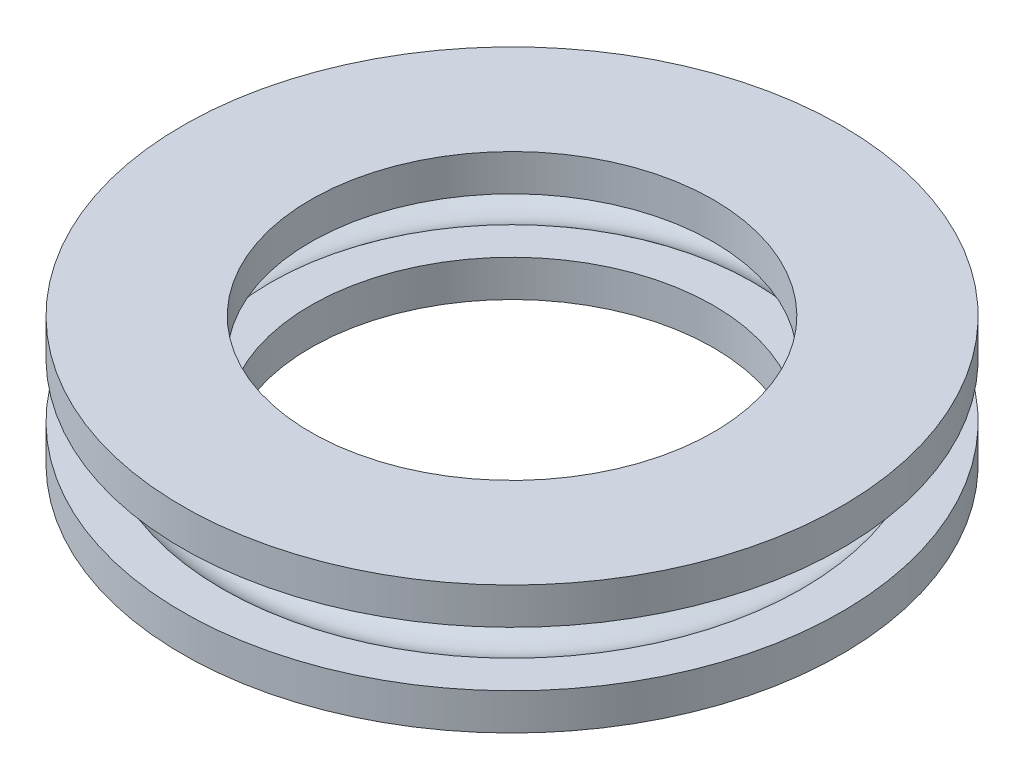
ISO-10303-21;
HEADER;
FILE_DESCRIPTION(('STEP AP214'),'2;1');
FILE_NAME('part.step','',(''),(''),'','','');
FILE_SCHEMA(('AUTOMOTIVE_DESIGN { 1 0 10303 214 1 1 1 1 }'));
ENDSEC;
DATA;
#1=APPLICATION_CONTEXT('core data for automotive mechanical design processes');
#2=APPLICATION_PROTOCOL_DEFINITION('international standard','automotive_design',2000,#1);
#3=PRODUCT_CONTEXT('',#1,'mechanical');
#4=PRODUCT('Part','Part','',(#3));
#5=PRODUCT_RELATED_PRODUCT_CATEGORY('part','',(#4));
#6=PRODUCT_DEFINITION_FORMATION('','',#4);
#7=PRODUCT_DEFINITION_CONTEXT('part definition',#1,'design');
#8=PRODUCT_DEFINITION('design','',#6,#7);
#9=PRODUCT_DEFINITION_SHAPE('','',#8);
#10=(LENGTH_UNIT() NAMED_UNIT(*) SI_UNIT(.MILLI.,.METRE.));
#11=(NAMED_UNIT(*) PLANE_ANGLE_UNIT() SI_UNIT($,.RADIAN.));
#12=(NAMED_UNIT(*) SI_UNIT($,.STERADIAN.) SOLID_ANGLE_UNIT());
#13=UNCERTAINTY_MEASURE_WITH_UNIT(LENGTH_MEASURE(1.E-05),#10,'distance_accuracy_value','');
#14=(GEOMETRIC_REPRESENTATION_CONTEXT(3) GLOBAL_UNCERTAINTY_ASSIGNED_CONTEXT((#13)) GLOBAL_UNIT_ASSIGNED_CONTEXT((#10,
#11,#12)) REPRESENTATION_CONTEXT('',''));
#15=CARTESIAN_POINT('',(0.,0.,0.));
#16=DIRECTION('',(0.,0.,1.));
#17=DIRECTION('',(1.,0.,0.));
#18=AXIS2_PLACEMENT_3D('',#15,#16,#17);
#19=CARTESIAN_POINT('',(0.,0.,0.));
#20=DIRECTION('',(0.,-1.,0.));
#21=DIRECTION('',(0.,0.,-1.));
#22=AXIS2_PLACEMENT_3D('',#19,#20,#21);
#23=TOROIDAL_SURFACE('',#22,36.25,4.99999999999998);
#24=CARTESIAN_POINT('',(0.,3.74999999999999,0.));
#25=DIRECTION('',(0.,-1.,0.));
#26=DIRECTION('',(0.,0.,-1.));
#27=AXIS2_PLACEMENT_3D('',#24,#25,#26);
#28=CIRCLE('',#27,39.5571891388307);
#29=CARTESIAN_POINT('',(0.,3.74999999999999,-39.5571891388307));
#30=VERTEX_POINT('',#29);
#31=EDGE_CURVE('E67',#30,#30,#28,.T.);
#32=ORIENTED_EDGE('',*,*,#31,.T.);
#33=EDGE_LOOP('',(#32));
#34=FACE_BOUND('',#33,.T.);
#35=CARTESIAN_POINT('',(0.,3.74999999999999,0.));
#36=DIRECTION('',(0.,-1.,0.));
#37=DIRECTION('',(0.,0.,-1.));
#38=AXIS2_PLACEMENT_3D('',#35,#36,#37);
#39=CIRCLE('',#38,32.9428108611692);
#40=CARTESIAN_POINT('',(0.,3.74999999999999,-32.9428108611692));
#41=VERTEX_POINT('',#40);
#42=EDGE_CURVE('E11',#41,#41,#39,.T.);
#43=ORIENTED_EDGE('',*,*,#42,.F.);
#44=EDGE_LOOP('',(#43));
#45=FACE_BOUND('',#44,.T.);
#46=ADVANCED_FACE('F45',(#34,#45),#23,.F.);
#47=CARTESIAN_POINT('',(0.,3.74999999999998,-27.4999999999999));
#48=DIRECTION('',(0.,-1.,0.));
#49=DIRECTION('',(0.,0.,-1.));
#50=AXIS2_PLACEMENT_3D('',#47,#48,#49);
#51=PLANE('',#50);
#52=ORIENTED_EDGE('',*,*,#42,.T.);
#53=EDGE_LOOP('',(#52));
#54=FACE_BOUND('',#53,.T.);
#55=CARTESIAN_POINT('',(0.,3.74999999999998,0.));
#56=DIRECTION('',(0.,-1.,0.));
#57=DIRECTION('',(0.,0.,-1.));
#58=AXIS2_PLACEMENT_3D('',#55,#56,#57);
#59=CIRCLE('',#58,27.4999999999999);
#60=CARTESIAN_POINT('',(0.,3.74999999999998,-27.4999999999999));
#61=VERTEX_POINT('',#60);
#62=EDGE_CURVE('E51',#61,#61,#59,.T.);
#63=ORIENTED_EDGE('',*,*,#62,.F.);
#64=EDGE_LOOP('',(#63));
#65=FACE_BOUND('',#64,.T.);
#66=ADVANCED_FACE('F85',(#54,#65),#51,.T.);
#67=CARTESIAN_POINT('',(0.,-72.7775968739822,0.));
#68=DIRECTION('',(0.,-1.,0.));
#69=DIRECTION('',(0.,0.,-1.));
#70=AXIS2_PLACEMENT_3D('',#67,#68,#69);
#71=CYLINDRICAL_SURFACE('',#70,27.4999999999999);
#72=ORIENTED_EDGE('',*,*,#62,.T.);
#73=EDGE_LOOP('',(#72));
#74=FACE_BOUND('',#73,.T.);
#75=CARTESIAN_POINT('',(0.,8.74999999999999,0.));
#76=DIRECTION('',(0.,-1.,0.));
#77=DIRECTION('',(0.,0.,-1.));
#78=AXIS2_PLACEMENT_3D('',#75,#76,#77);
#79=CIRCLE('',#78,27.4999999999999);
#80=CARTESIAN_POINT('',(0.,8.74999999999999,-27.4999999999999));
#81=VERTEX_POINT('',#80);
#82=EDGE_CURVE('E55',#81,#81,#79,.T.);
#83=ORIENTED_EDGE('',*,*,#82,.F.);
#84=EDGE_LOOP('',(#83));
#85=FACE_BOUND('',#84,.T.);
#86=ADVANCED_FACE('F89',(#74,#85),#71,.F.);
#87=CARTESIAN_POINT('',(0.,8.74999999999999,-27.4999999999999));
#88=DIRECTION('',(0.,1.,0.));
#89=DIRECTION('',(0.,0.,1.));
#90=AXIS2_PLACEMENT_3D('',#87,#88,#89);
#91=PLANE('',#90);
#92=ORIENTED_EDGE('',*,*,#82,.T.);
#93=EDGE_LOOP('',(#92));
#94=FACE_BOUND('',#93,.T.);
#95=CARTESIAN_POINT('',(0.,8.74999999999999,0.));
#96=DIRECTION('',(0.,-1.,0.));
#97=DIRECTION('',(0.,0.,-1.));
#98=AXIS2_PLACEMENT_3D('',#95,#96,#97);
#99=CIRCLE('',#98,44.9999999999999);
#100=CARTESIAN_POINT('',(0.,8.74999999999999,-44.9999999999999));
#101=VERTEX_POINT('',#100);
#102=EDGE_CURVE('E59',#101,#101,#99,.T.);
#103=ORIENTED_EDGE('',*,*,#102,.F.);
#104=EDGE_LOOP('',(#103));
#105=FACE_BOUND('',#104,.T.);
#106=ADVANCED_FACE('F81',(#94,#105),#91,.T.);
#107=CARTESIAN_POINT('',(0.,-72.7775968739822,0.));
#108=DIRECTION('',(0.,-1.,0.));
#109=DIRECTION('',(0.,0.,-1.));
#110=AXIS2_PLACEMENT_3D('',#107,#108,#109);
#111=CYLINDRICAL_SURFACE('',#110,44.9999999999999);
#112=ORIENTED_EDGE('',*,*,#102,.T.);
#113=EDGE_LOOP('',(#112));
#114=FACE_BOUND('',#113,.T.);
#115=CARTESIAN_POINT('',(0.,3.74999999999999,0.));
#116=DIRECTION('',(0.,-1.,0.));
#117=DIRECTION('',(0.,0.,-1.));
#118=AXIS2_PLACEMENT_3D('',#115,#116,#117);
#119=CIRCLE('',#118,44.9999999999999);
#120=CARTESIAN_POINT('',(0.,3.74999999999999,-44.9999999999999));
#121=VERTEX_POINT('',#120);
#122=EDGE_CURVE('E64',#121,#121,#119,.T.);
#123=ORIENTED_EDGE('',*,*,#122,.F.);
#124=EDGE_LOOP('',(#123));
#125=FACE_BOUND('',#124,.T.);
#126=ADVANCED_FACE('F75',(#114,#125),#111,.T.);
#127=CARTESIAN_POINT('',(0.,3.74999999999999,-39.5571891388307));
#128=DIRECTION('',(0.,-1.,0.));
#129=DIRECTION('',(0.,0.,-1.));
#130=AXIS2_PLACEMENT_3D('',#127,#128,#129);
#131=PLANE('',#130);
#132=ORIENTED_EDGE('',*,*,#122,.T.);
#133=EDGE_LOOP('',(#132));
#134=FACE_BOUND('',#133,.T.);
#135=ORIENTED_EDGE('',*,*,#31,.F.);
#136=EDGE_LOOP('',(#135));
#137=FACE_BOUND('',#136,.T.);
#138=ADVANCED_FACE('F73',(#134,#137),#131,.T.);
#139=CLOSED_SHELL('',(#46,#66,#86,#106,#126,#138));
#140=MANIFOLD_SOLID_BREP('B2',#139);
#141=CARTESIAN_POINT('',(0.,-3.74999999999998,-39.5571891388307));
#142=DIRECTION('',(0.,1.,0.));
#143=DIRECTION('',(0.,0.,1.));
#144=AXIS2_PLACEMENT_3D('',#141,#142,#143);
#145=PLANE('',#144);
#146=CARTESIAN_POINT('',(0.,-3.74999999999999,0.));
#147=DIRECTION('',(0.,-1.,0.));
#148=DIRECTION('',(0.,0.,-1.));
#149=AXIS2_PLACEMENT_3D('',#146,#147,#148);
#150=CIRCLE('',#149,39.5571891388307);
#151=CARTESIAN_POINT('',(0.,-3.74999999999999,-39.5571891388307));
#152=VERTEX_POINT('',#151);
#153=EDGE_CURVE('E44',#152,#152,#150,.T.);
#154=ORIENTED_EDGE('',*,*,#153,.T.);
#155=EDGE_LOOP('',(#154));
#156=FACE_BOUND('',#155,.T.);
#157=CARTESIAN_POINT('',(0.,-3.74999999999999,0.));
#158=DIRECTION('',(0.,-1.,0.));
#159=DIRECTION('',(0.,0.,-1.));
#160=AXIS2_PLACEMENT_3D('',#157,#158,#159);
#161=CIRCLE('',#160,45.);
#162=CARTESIAN_POINT('',(0.,-3.74999999999999,-45.));
#163=VERTEX_POINT('',#162);
#164=EDGE_CURVE('E159',#163,#163,#161,.T.);
#165=ORIENTED_EDGE('',*,*,#164,.F.);
#166=EDGE_LOOP('',(#165));
#167=FACE_BOUND('',#166,.T.);
#168=ADVANCED_FACE('F137',(#156,#167),#145,.T.);
#169=CARTESIAN_POINT('',(0.,0.,0.));
#170=DIRECTION('',(0.,-1.,0.));
#171=DIRECTION('',(0.,0.,-1.));
#172=AXIS2_PLACEMENT_3D('',#169,#170,#171);
#173=TOROIDAL_SURFACE('',#172,36.25,5.);
#174=CARTESIAN_POINT('',(0.,-3.74999999999999,0.));
#175=DIRECTION('',(0.,-1.,0.));
#176=DIRECTION('',(0.,0.,-1.));
#177=AXIS2_PLACEMENT_3D('',#174,#175,#176);
#178=CIRCLE('',#177,32.9428108611693);
#179=CARTESIAN_POINT('',(0.,-3.74999999999999,-32.9428108611693));
#180=VERTEX_POINT('',#179);
#181=EDGE_CURVE('E143',#180,#180,#178,.T.);
#182=ORIENTED_EDGE('',*,*,#181,.T.);
#183=EDGE_LOOP('',(#182));
#184=FACE_BOUND('',#183,.T.);
#185=ORIENTED_EDGE('',*,*,#153,.F.);
#186=EDGE_LOOP('',(#185));
#187=FACE_BOUND('',#186,.T.);
#188=ADVANCED_FACE('F167',(#184,#187),#173,.F.);
#189=CARTESIAN_POINT('',(0.,-3.74999999999998,-27.5));
#190=DIRECTION('',(0.,1.,0.));
#191=DIRECTION('',(0.,0.,1.));
#192=AXIS2_PLACEMENT_3D('',#189,#190,#191);
#193=PLANE('',#192);
#194=CARTESIAN_POINT('',(0.,-3.74999999999998,0.));
#195=DIRECTION('',(0.,-1.,0.));
#196=DIRECTION('',(0.,0.,-1.));
#197=AXIS2_PLACEMENT_3D('',#194,#195,#196);
#198=CIRCLE('',#197,27.5);
#199=CARTESIAN_POINT('',(0.,-3.74999999999998,-27.5));
#200=VERTEX_POINT('',#199);
#201=EDGE_CURVE('E147',#200,#200,#198,.T.);
#202=ORIENTED_EDGE('',*,*,#201,.T.);
#203=EDGE_LOOP('',(#202));
#204=FACE_BOUND('',#203,.T.);
#205=ORIENTED_EDGE('',*,*,#181,.F.);
#206=EDGE_LOOP('',(#205));
#207=FACE_BOUND('',#206,.T.);
#208=ADVANCED_FACE('F171',(#204,#207),#193,.T.);
#209=CARTESIAN_POINT('',(0.,-72.7775968739822,0.));
#210=DIRECTION('',(0.,-1.,0.));
#211=DIRECTION('',(0.,0.,-1.));
#212=AXIS2_PLACEMENT_3D('',#209,#210,#211);
#213=CYLINDRICAL_SURFACE('',#212,27.5);
#214=CARTESIAN_POINT('',(0.,-8.74999999999999,0.));
#215=DIRECTION('',(0.,-1.,0.));
#216=DIRECTION('',(0.,0.,-1.));
#217=AXIS2_PLACEMENT_3D('',#214,#215,#216);
#218=CIRCLE('',#217,27.5);
#219=CARTESIAN_POINT('',(0.,-8.74999999999999,-27.5));
#220=VERTEX_POINT('',#219);
#221=EDGE_CURVE('E151',#220,#220,#218,.T.);
#222=ORIENTED_EDGE('',*,*,#221,.T.);
#223=EDGE_LOOP('',(#222));
#224=FACE_BOUND('',#223,.T.);
#225=ORIENTED_EDGE('',*,*,#201,.F.);
#226=EDGE_LOOP('',(#225));
#227=FACE_BOUND('',#226,.T.);
#228=ADVANCED_FACE('F175',(#224,#227),#213,.F.);
#229=CARTESIAN_POINT('',(0.,-8.74999999999999,-27.5));
#230=DIRECTION('',(0.,-1.,0.));
#231=DIRECTION('',(0.,0.,-1.));
#232=AXIS2_PLACEMENT_3D('',#229,#230,#231);
#233=PLANE('',#232);
#234=CARTESIAN_POINT('',(0.,-8.74999999999999,0.));
#235=DIRECTION('',(0.,-1.,0.));
#236=DIRECTION('',(0.,0.,-1.));
#237=AXIS2_PLACEMENT_3D('',#234,#235,#236);
#238=CIRCLE('',#237,45.);
#239=CARTESIAN_POINT('',(0.,-8.74999999999999,-45.));
#240=VERTEX_POINT('',#239);
#241=EDGE_CURVE('E156',#240,#240,#238,.T.);
#242=ORIENTED_EDGE('',*,*,#241,.T.);
#243=EDGE_LOOP('',(#242));
#244=FACE_BOUND('',#243,.T.);
#245=ORIENTED_EDGE('',*,*,#221,.F.);
#246=EDGE_LOOP('',(#245));
#247=FACE_BOUND('',#246,.T.);
#248=ADVANCED_FACE('F182',(#244,#247),#233,.T.);
#249=CARTESIAN_POINT('',(0.,-72.7775968739822,0.));
#250=DIRECTION('',(0.,-1.,0.));
#251=DIRECTION('',(0.,0.,-1.));
#252=AXIS2_PLACEMENT_3D('',#249,#250,#251);
#253=CYLINDRICAL_SURFACE('',#252,45.);
#254=ORIENTED_EDGE('',*,*,#164,.T.);
#255=EDGE_LOOP('',(#254));
#256=FACE_BOUND('',#255,.T.);
#257=ORIENTED_EDGE('',*,*,#241,.F.);
#258=EDGE_LOOP('',(#257));
#259=FACE_BOUND('',#258,.T.);
#260=ADVANCED_FACE('F163',(#256,#259),#253,.T.);
#261=CLOSED_SHELL('',(#168,#188,#208,#228,#248,#260));
#262=MANIFOLD_SOLID_BREP('B6',#261);
#263=ADVANCED_BREP_SHAPE_REPRESENTATION('',(#18,#140,#262),#14);
#264=SHAPE_DEFINITION_REPRESENTATION(#9,#263);
ENDSEC;
END-ISO-10303-21;
